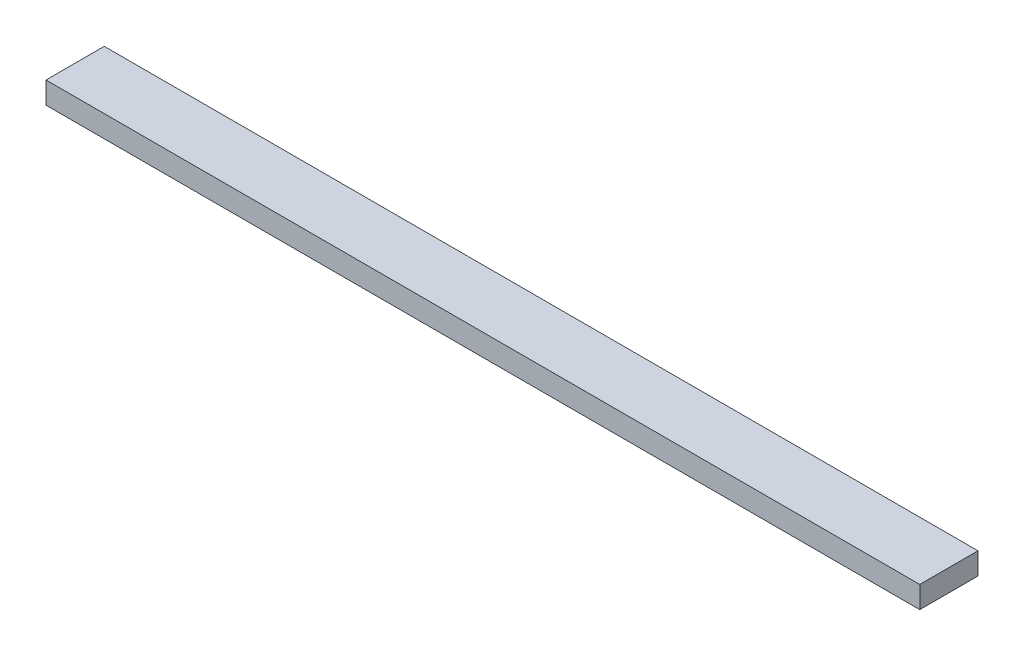
ISO-10303-21;
HEADER;
FILE_DESCRIPTION(('STEP AP214'),'2;1');
FILE_NAME('part.step','',(''),(''),'','','');
FILE_SCHEMA(('AUTOMOTIVE_DESIGN { 1 0 10303 214 1 1 1 1 }'));
ENDSEC;
DATA;
#1=APPLICATION_CONTEXT('core data for automotive mechanical design processes');
#2=APPLICATION_PROTOCOL_DEFINITION('international standard','automotive_design',2000,#1);
#3=PRODUCT_CONTEXT('',#1,'mechanical');
#4=PRODUCT('Part','Part','',(#3));
#5=PRODUCT_RELATED_PRODUCT_CATEGORY('part','',(#4));
#6=PRODUCT_DEFINITION_FORMATION('','',#4);
#7=PRODUCT_DEFINITION_CONTEXT('part definition',#1,'design');
#8=PRODUCT_DEFINITION('design','',#6,#7);
#9=PRODUCT_DEFINITION_SHAPE('','',#8);
#10=(LENGTH_UNIT() NAMED_UNIT(*) SI_UNIT(.MILLI.,.METRE.));
#11=(NAMED_UNIT(*) PLANE_ANGLE_UNIT() SI_UNIT($,.RADIAN.));
#12=(NAMED_UNIT(*) SI_UNIT($,.STERADIAN.) SOLID_ANGLE_UNIT());
#13=UNCERTAINTY_MEASURE_WITH_UNIT(LENGTH_MEASURE(1.E-05),#10,'distance_accuracy_value','');
#14=(GEOMETRIC_REPRESENTATION_CONTEXT(3) GLOBAL_UNCERTAINTY_ASSIGNED_CONTEXT((#13)) GLOBAL_UNIT_ASSIGNED_CONTEXT((#10,
#11,#12)) REPRESENTATION_CONTEXT('',''));
#15=CARTESIAN_POINT('',(0.,0.,0.));
#16=DIRECTION('',(0.,0.,1.));
#17=DIRECTION('',(1.,0.,0.));
#18=AXIS2_PLACEMENT_3D('',#15,#16,#17);
#19=CARTESIAN_POINT('',(381.,19.05,25.4));
#20=DIRECTION('',(-1.,0.,0.));
#21=DIRECTION('',(0.,0.,1.));
#22=AXIS2_PLACEMENT_3D('',#19,#20,#21);
#23=PLANE('',#22);
#24=DIRECTION('',(0.,0.,-1.));
#25=VECTOR('',#24,1.);
#26=CARTESIAN_POINT('',(381.,0.,25.4));
#27=LINE('',#26,#25);
#28=CARTESIAN_POINT('',(381.,0.,25.4));
#29=VERTEX_POINT('',#28);
#30=CARTESIAN_POINT('',(381.,0.,-25.4));
#31=VERTEX_POINT('',#30);
#32=EDGE_CURVE('E107',#29,#31,#27,.T.);
#33=ORIENTED_EDGE('',*,*,#32,.T.);
#34=DIRECTION('',(0.,-1.,0.));
#35=VECTOR('',#34,1.);
#36=CARTESIAN_POINT('',(381.,19.05,-25.4));
#37=LINE('',#36,#35);
#38=CARTESIAN_POINT('',(381.,19.05,-25.4));
#39=VERTEX_POINT('',#38);
#40=EDGE_CURVE('E11',#39,#31,#37,.T.);
#41=ORIENTED_EDGE('',*,*,#40,.F.);
#42=DIRECTION('',(0.,0.,-1.));
#43=VECTOR('',#42,1.);
#44=CARTESIAN_POINT('',(381.,19.05,25.4));
#45=LINE('',#44,#43);
#46=CARTESIAN_POINT('',(381.,19.05,25.4));
#47=VERTEX_POINT('',#46);
#48=EDGE_CURVE('E91',#47,#39,#45,.T.);
#49=ORIENTED_EDGE('',*,*,#48,.F.);
#50=DIRECTION('',(0.,-1.,0.));
#51=VECTOR('',#50,1.);
#52=CARTESIAN_POINT('',(381.,19.05,25.4));
#53=LINE('',#52,#51);
#54=EDGE_CURVE('E103',#47,#29,#53,.T.);
#55=ORIENTED_EDGE('',*,*,#54,.T.);
#56=EDGE_LOOP('',(#33,#41,#49,#55));
#57=FACE_BOUND('',#56,.T.);
#58=ADVANCED_FACE('F39',(#57),#23,.F.);
#59=CARTESIAN_POINT('',(-381.,19.05,-25.4));
#60=DIRECTION('',(0.,0.,1.));
#61=DIRECTION('',(1.,0.,0.));
#62=AXIS2_PLACEMENT_3D('',#59,#60,#61);
#63=PLANE('',#62);
#64=DIRECTION('',(-1.,0.,0.));
#65=VECTOR('',#64,1.);
#66=CARTESIAN_POINT('',(-381.,0.,-25.4));
#67=LINE('',#66,#65);
#68=CARTESIAN_POINT('',(-381.,0.,-25.4));
#69=VERTEX_POINT('',#68);
#70=EDGE_CURVE('E96',#31,#69,#67,.T.);
#71=ORIENTED_EDGE('',*,*,#70,.T.);
#72=DIRECTION('',(0.,-1.,0.));
#73=VECTOR('',#72,1.);
#74=CARTESIAN_POINT('',(-381.,19.05,-25.4));
#75=LINE('',#74,#73);
#76=CARTESIAN_POINT('',(-381.,19.05,-25.4));
#77=VERTEX_POINT('',#76);
#78=EDGE_CURVE('E48',#77,#69,#75,.T.);
#79=ORIENTED_EDGE('',*,*,#78,.F.);
#80=DIRECTION('',(-1.,0.,0.));
#81=VECTOR('',#80,1.);
#82=CARTESIAN_POINT('',(-381.,19.05,-25.4));
#83=LINE('',#82,#81);
#84=EDGE_CURVE('E86',#39,#77,#83,.T.);
#85=ORIENTED_EDGE('',*,*,#84,.F.);
#86=ORIENTED_EDGE('',*,*,#40,.T.);
#87=EDGE_LOOP('',(#71,#79,#85,#86));
#88=FACE_BOUND('',#87,.T.);
#89=ADVANCED_FACE('F95',(#88),#63,.F.);
#90=CARTESIAN_POINT('',(-381.,19.05,25.4));
#91=DIRECTION('',(1.,0.,0.));
#92=DIRECTION('',(0.,0.,-1.));
#93=AXIS2_PLACEMENT_3D('',#90,#91,#92);
#94=PLANE('',#93);
#95=DIRECTION('',(0.,0.,1.));
#96=VECTOR('',#95,1.);
#97=CARTESIAN_POINT('',(-381.,0.,25.4));
#98=LINE('',#97,#96);
#99=CARTESIAN_POINT('',(-381.,0.,25.4));
#100=VERTEX_POINT('',#99);
#101=EDGE_CURVE('E73',#69,#100,#98,.T.);
#102=ORIENTED_EDGE('',*,*,#101,.T.);
#103=DIRECTION('',(0.,-1.,0.));
#104=VECTOR('',#103,1.);
#105=CARTESIAN_POINT('',(-381.,19.05,25.4));
#106=LINE('',#105,#104);
#107=CARTESIAN_POINT('',(-381.,19.05,25.4));
#108=VERTEX_POINT('',#107);
#109=EDGE_CURVE('E98',#108,#100,#106,.T.);
#110=ORIENTED_EDGE('',*,*,#109,.F.);
#111=DIRECTION('',(0.,0.,1.));
#112=VECTOR('',#111,1.);
#113=CARTESIAN_POINT('',(-381.,19.05,25.4));
#114=LINE('',#113,#112);
#115=EDGE_CURVE('E89',#77,#108,#114,.T.);
#116=ORIENTED_EDGE('',*,*,#115,.F.);
#117=ORIENTED_EDGE('',*,*,#78,.T.);
#118=EDGE_LOOP('',(#102,#110,#116,#117));
#119=FACE_BOUND('',#118,.T.);
#120=ADVANCED_FACE('F99',(#119),#94,.F.);
#121=CARTESIAN_POINT('',(-381.,19.05,25.4));
#122=DIRECTION('',(0.,0.,-1.));
#123=DIRECTION('',(-1.,0.,0.));
#124=AXIS2_PLACEMENT_3D('',#121,#122,#123);
#125=PLANE('',#124);
#126=DIRECTION('',(1.,0.,0.));
#127=VECTOR('',#126,1.);
#128=CARTESIAN_POINT('',(-381.,0.,25.4));
#129=LINE('',#128,#127);
#130=EDGE_CURVE('E79',#100,#29,#129,.T.);
#131=ORIENTED_EDGE('',*,*,#130,.T.);
#132=ORIENTED_EDGE('',*,*,#54,.F.);
#133=DIRECTION('',(1.,0.,0.));
#134=VECTOR('',#133,1.);
#135=CARTESIAN_POINT('',(-381.,19.05,25.4));
#136=LINE('',#135,#134);
#137=EDGE_CURVE('E56',#108,#47,#136,.T.);
#138=ORIENTED_EDGE('',*,*,#137,.F.);
#139=ORIENTED_EDGE('',*,*,#109,.T.);
#140=EDGE_LOOP('',(#131,#132,#138,#139));
#141=FACE_BOUND('',#140,.T.);
#142=ADVANCED_FACE('F120',(#141),#125,.F.);
#143=CARTESIAN_POINT('',(0.,19.05,0.));
#144=DIRECTION('',(0.,-1.,0.));
#145=DIRECTION('',(0.,0.,-1.));
#146=AXIS2_PLACEMENT_3D('',#143,#144,#145);
#147=PLANE('',#146);
#148=ORIENTED_EDGE('',*,*,#48,.T.);
#149=ORIENTED_EDGE('',*,*,#84,.T.);
#150=ORIENTED_EDGE('',*,*,#115,.T.);
#151=ORIENTED_EDGE('',*,*,#137,.T.);
#152=EDGE_LOOP('',(#148,#149,#150,#151));
#153=FACE_BOUND('',#152,.T.);
#154=ADVANCED_FACE('F87',(#153),#147,.F.);
#155=CARTESIAN_POINT('',(0.,0.,0.));
#156=DIRECTION('',(0.,-1.,0.));
#157=DIRECTION('',(0.,0.,-1.));
#158=AXIS2_PLACEMENT_3D('',#155,#156,#157);
#159=PLANE('',#158);
#160=ORIENTED_EDGE('',*,*,#32,.F.);
#161=ORIENTED_EDGE('',*,*,#130,.F.);
#162=ORIENTED_EDGE('',*,*,#101,.F.);
#163=ORIENTED_EDGE('',*,*,#70,.F.);
#164=EDGE_LOOP('',(#160,#161,#162,#163));
#165=FACE_BOUND('',#164,.T.);
#166=ADVANCED_FACE('F123',(#165),#159,.T.);
#167=CLOSED_SHELL('',(#58,#89,#120,#142,#154,#166));
#168=MANIFOLD_SOLID_BREP('B2',#167);
#169=ADVANCED_BREP_SHAPE_REPRESENTATION('',(#18,#168),#14);
#170=SHAPE_DEFINITION_REPRESENTATION(#9,#169);
ENDSEC;
END-ISO-10303-21;
